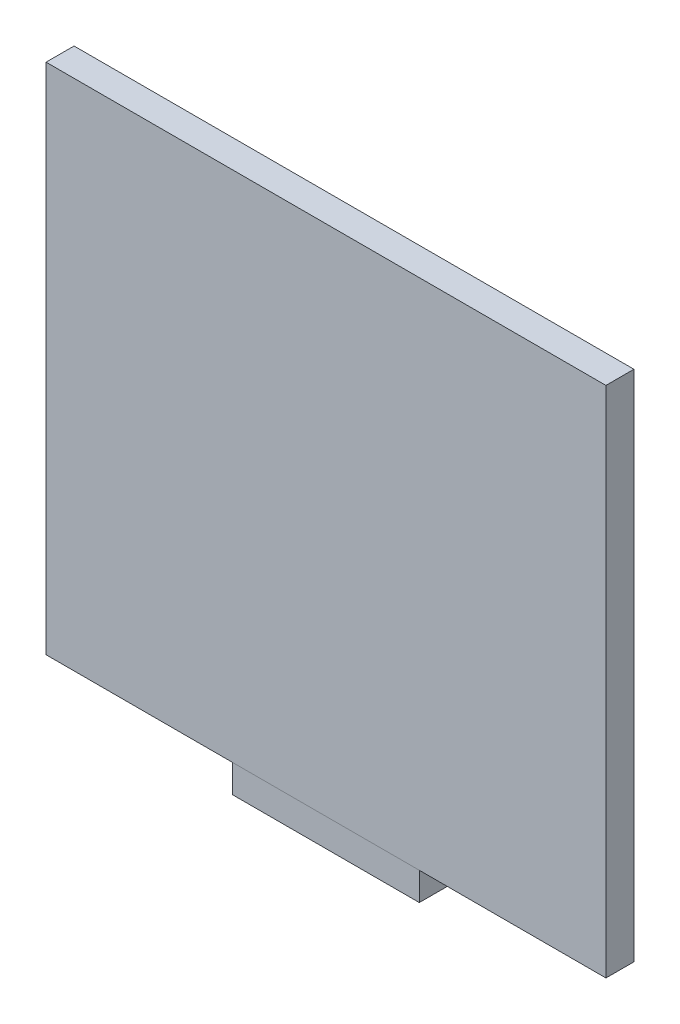
ISO-10303-21;
HEADER;
FILE_DESCRIPTION(('STEP AP214'),'2;1');
FILE_NAME('part.step','',(''),(''),'','','');
FILE_SCHEMA(('AUTOMOTIVE_DESIGN { 1 0 10303 214 1 1 1 1 }'));
ENDSEC;
DATA;
#1=APPLICATION_CONTEXT('core data for automotive mechanical design processes');
#2=APPLICATION_PROTOCOL_DEFINITION('international standard','automotive_design',2000,#1);
#3=PRODUCT_CONTEXT('',#1,'mechanical');
#4=PRODUCT('Part','Part','',(#3));
#5=PRODUCT_RELATED_PRODUCT_CATEGORY('part','',(#4));
#6=PRODUCT_DEFINITION_FORMATION('','',#4);
#7=PRODUCT_DEFINITION_CONTEXT('part definition',#1,'design');
#8=PRODUCT_DEFINITION('design','',#6,#7);
#9=PRODUCT_DEFINITION_SHAPE('','',#8);
#10=(LENGTH_UNIT() NAMED_UNIT(*) SI_UNIT(.MILLI.,.METRE.));
#11=(NAMED_UNIT(*) PLANE_ANGLE_UNIT() SI_UNIT($,.RADIAN.));
#12=(NAMED_UNIT(*) SI_UNIT($,.STERADIAN.) SOLID_ANGLE_UNIT());
#13=UNCERTAINTY_MEASURE_WITH_UNIT(LENGTH_MEASURE(1.E-05),#10,'distance_accuracy_value','');
#14=(GEOMETRIC_REPRESENTATION_CONTEXT(3) GLOBAL_UNCERTAINTY_ASSIGNED_CONTEXT((#13)) GLOBAL_UNIT_ASSIGNED_CONTEXT((#10,
#11,#12)) REPRESENTATION_CONTEXT('',''));
#15=CARTESIAN_POINT('',(0.,0.,0.));
#16=DIRECTION('',(0.,0.,1.));
#17=DIRECTION('',(1.,0.,0.));
#18=AXIS2_PLACEMENT_3D('',#15,#16,#17);
#19=CARTESIAN_POINT('',(20.,0.,-3.));
#20=DIRECTION('',(-1.,0.,0.));
#21=DIRECTION('',(0.,0.,1.));
#22=AXIS2_PLACEMENT_3D('',#19,#20,#21);
#23=PLANE('',#22);
#24=DIRECTION('',(0.,-1.,0.));
#25=VECTOR('',#24,1.);
#26=CARTESIAN_POINT('',(20.,0.,0.));
#27=LINE('',#26,#25);
#28=CARTESIAN_POINT('',(20.,0.,0.));
#29=VERTEX_POINT('',#28);
#30=CARTESIAN_POINT('',(20.,-3.,0.));
#31=VERTEX_POINT('',#30);
#32=EDGE_CURVE('E109',#29,#31,#27,.T.);
#33=ORIENTED_EDGE('',*,*,#32,.F.);
#34=DIRECTION('',(0.,0.,1.));
#35=VECTOR('',#34,1.);
#36=CARTESIAN_POINT('',(20.,0.,-3.));
#37=LINE('',#36,#35);
#38=CARTESIAN_POINT('',(20.,0.,-3.));
#39=VERTEX_POINT('',#38);
#40=EDGE_CURVE('E12',#39,#29,#37,.T.);
#41=ORIENTED_EDGE('',*,*,#40,.F.);
#42=DIRECTION('',(0.,-1.,0.));
#43=VECTOR('',#42,1.);
#44=CARTESIAN_POINT('',(20.,0.,-3.));
#45=LINE('',#44,#43);
#46=CARTESIAN_POINT('',(20.,-3.,-3.));
#47=VERTEX_POINT('',#46);
#48=EDGE_CURVE('E103',#39,#47,#45,.T.);
#49=ORIENTED_EDGE('',*,*,#48,.T.);
#50=DIRECTION('',(0.,0.,1.));
#51=VECTOR('',#50,1.);
#52=CARTESIAN_POINT('',(20.,-3.,-3.));
#53=LINE('',#52,#51);
#54=EDGE_CURVE('E48',#47,#31,#53,.T.);
#55=ORIENTED_EDGE('',*,*,#54,.T.);
#56=EDGE_LOOP('',(#33,#41,#49,#55));
#57=FACE_BOUND('',#56,.T.);
#58=ADVANCED_FACE('F45',(#57),#23,.T.);
#59=CARTESIAN_POINT('',(20.,0.,-3.));
#60=DIRECTION('',(0.,1.,0.));
#61=DIRECTION('',(0.,0.,1.));
#62=AXIS2_PLACEMENT_3D('',#59,#60,#61);
#63=PLANE('',#62);
#64=DIRECTION('',(-1.,0.,0.));
#65=VECTOR('',#64,1.);
#66=CARTESIAN_POINT('',(20.,0.,0.));
#67=LINE('',#66,#65);
#68=CARTESIAN_POINT('',(40.,0.,0.));
#69=VERTEX_POINT('',#68);
#70=EDGE_CURVE('E105',#69,#29,#67,.T.);
#71=ORIENTED_EDGE('',*,*,#70,.F.);
#72=DIRECTION('',(0.,0.,1.));
#73=VECTOR('',#72,1.);
#74=CARTESIAN_POINT('',(40.,0.,-3.));
#75=LINE('',#74,#73);
#76=CARTESIAN_POINT('',(40.,0.,-3.));
#77=VERTEX_POINT('',#76);
#78=EDGE_CURVE('E54',#77,#69,#75,.T.);
#79=ORIENTED_EDGE('',*,*,#78,.F.);
#80=DIRECTION('',(-1.,0.,0.));
#81=VECTOR('',#80,1.);
#82=CARTESIAN_POINT('',(20.,0.,-3.));
#83=LINE('',#82,#81);
#84=EDGE_CURVE('E100',#77,#39,#83,.T.);
#85=ORIENTED_EDGE('',*,*,#84,.T.);
#86=ORIENTED_EDGE('',*,*,#40,.T.);
#87=EDGE_LOOP('',(#71,#79,#85,#86));
#88=FACE_BOUND('',#87,.T.);
#89=ADVANCED_FACE('F119',(#88),#63,.T.);
#90=CARTESIAN_POINT('',(40.,0.,-3.));
#91=DIRECTION('',(1.,0.,0.));
#92=DIRECTION('',(0.,0.,-1.));
#93=AXIS2_PLACEMENT_3D('',#90,#91,#92);
#94=PLANE('',#93);
#95=DIRECTION('',(0.,1.,0.));
#96=VECTOR('',#95,1.);
#97=CARTESIAN_POINT('',(40.,0.,0.));
#98=LINE('',#97,#96);
#99=CARTESIAN_POINT('',(40.,-3.,0.));
#100=VERTEX_POINT('',#99);
#101=EDGE_CURVE('E95',#100,#69,#98,.T.);
#102=ORIENTED_EDGE('',*,*,#101,.F.);
#103=DIRECTION('',(0.,0.,1.));
#104=VECTOR('',#103,1.);
#105=CARTESIAN_POINT('',(40.,-3.,-3.));
#106=LINE('',#105,#104);
#107=CARTESIAN_POINT('',(40.,-3.,-3.));
#108=VERTEX_POINT('',#107);
#109=EDGE_CURVE('E90',#108,#100,#106,.T.);
#110=ORIENTED_EDGE('',*,*,#109,.F.);
#111=DIRECTION('',(0.,1.,0.));
#112=VECTOR('',#111,1.);
#113=CARTESIAN_POINT('',(40.,0.,-3.));
#114=LINE('',#113,#112);
#115=EDGE_CURVE('E93',#108,#77,#114,.T.);
#116=ORIENTED_EDGE('',*,*,#115,.T.);
#117=ORIENTED_EDGE('',*,*,#78,.T.);
#118=EDGE_LOOP('',(#102,#110,#116,#117));
#119=FACE_BOUND('',#118,.T.);
#120=ADVANCED_FACE('F92',(#119),#94,.T.);
#121=CARTESIAN_POINT('',(20.,-3.,-3.));
#122=DIRECTION('',(0.,-1.,0.));
#123=DIRECTION('',(1.,0.,0.));
#124=AXIS2_PLACEMENT_3D('',#121,#122,#123);
#125=PLANE('',#124);
#126=DIRECTION('',(1.,0.,0.));
#127=VECTOR('',#126,1.);
#128=CARTESIAN_POINT('',(20.,-3.,0.));
#129=LINE('',#128,#127);
#130=EDGE_CURVE('E112',#31,#100,#129,.T.);
#131=ORIENTED_EDGE('',*,*,#130,.F.);
#132=ORIENTED_EDGE('',*,*,#54,.F.);
#133=DIRECTION('',(1.,0.,0.));
#134=VECTOR('',#133,1.);
#135=CARTESIAN_POINT('',(20.,-3.,-3.));
#136=LINE('',#135,#134);
#137=EDGE_CURVE('E99',#47,#108,#136,.T.);
#138=ORIENTED_EDGE('',*,*,#137,.T.);
#139=ORIENTED_EDGE('',*,*,#109,.T.);
#140=EDGE_LOOP('',(#131,#132,#138,#139));
#141=FACE_BOUND('',#140,.T.);
#142=ADVANCED_FACE('F102',(#141),#125,.T.);
#143=CARTESIAN_POINT('',(0.,0.,-3.));
#144=DIRECTION('',(0.,0.,1.));
#145=DIRECTION('',(1.,0.,0.));
#146=AXIS2_PLACEMENT_3D('',#143,#144,#145);
#147=PLANE('',#146);
#148=ORIENTED_EDGE('',*,*,#48,.F.);
#149=ORIENTED_EDGE('',*,*,#84,.F.);
#150=ORIENTED_EDGE('',*,*,#115,.F.);
#151=ORIENTED_EDGE('',*,*,#137,.F.);
#152=EDGE_LOOP('',(#148,#149,#150,#151));
#153=FACE_BOUND('',#152,.T.);
#154=ADVANCED_FACE('F98',(#153),#147,.F.);
#155=CARTESIAN_POINT('',(0.,0.,0.));
#156=DIRECTION('',(0.,0.,1.));
#157=DIRECTION('',(1.,0.,0.));
#158=AXIS2_PLACEMENT_3D('',#155,#156,#157);
#159=PLANE('',#158);
#160=ORIENTED_EDGE('',*,*,#32,.T.);
#161=ORIENTED_EDGE('',*,*,#130,.T.);
#162=ORIENTED_EDGE('',*,*,#101,.T.);
#163=ORIENTED_EDGE('',*,*,#70,.T.);
#164=EDGE_LOOP('',(#160,#161,#162,#163));
#165=FACE_BOUND('',#164,.T.);
#166=ADVANCED_FACE('F118',(#165),#159,.T.);
#167=CLOSED_SHELL('',(#58,#89,#120,#142,#154,#166));
#168=MANIFOLD_SOLID_BREP('B2',#167);
#169=CARTESIAN_POINT('',(0.,0.,-3.));
#170=DIRECTION('',(-1.,0.,0.));
#171=DIRECTION('',(0.,-1.,0.));
#172=AXIS2_PLACEMENT_3D('',#169,#170,#171);
#173=PLANE('',#172);
#174=DIRECTION('',(0.,-1.,0.));
#175=VECTOR('',#174,1.);
#176=CARTESIAN_POINT('',(0.,0.,0.));
#177=LINE('',#176,#175);
#178=CARTESIAN_POINT('',(0.,55.,0.));
#179=VERTEX_POINT('',#178);
#180=CARTESIAN_POINT('',(0.,0.,0.));
#181=VERTEX_POINT('',#180);
#182=EDGE_CURVE('E233',#179,#181,#177,.T.);
#183=ORIENTED_EDGE('',*,*,#182,.F.);
#184=DIRECTION('',(0.,0.,1.));
#185=VECTOR('',#184,1.);
#186=CARTESIAN_POINT('',(0.,55.,-3.));
#187=LINE('',#186,#185);
#188=CARTESIAN_POINT('',(0.,55.,-3.));
#189=VERTEX_POINT('',#188);
#190=EDGE_CURVE('E43',#189,#179,#187,.T.);
#191=ORIENTED_EDGE('',*,*,#190,.F.);
#192=DIRECTION('',(0.,-1.,0.));
#193=VECTOR('',#192,1.);
#194=CARTESIAN_POINT('',(0.,0.,-3.));
#195=LINE('',#194,#193);
#196=CARTESIAN_POINT('',(0.,0.,-3.));
#197=VERTEX_POINT('',#196);
#198=EDGE_CURVE('E227',#189,#197,#195,.T.);
#199=ORIENTED_EDGE('',*,*,#198,.T.);
#200=DIRECTION('',(0.,0.,1.));
#201=VECTOR('',#200,1.);
#202=CARTESIAN_POINT('',(0.,0.,-3.));
#203=LINE('',#202,#201);
#204=EDGE_CURVE('E172',#197,#181,#203,.T.);
#205=ORIENTED_EDGE('',*,*,#204,.T.);
#206=EDGE_LOOP('',(#183,#191,#199,#205));
#207=FACE_BOUND('',#206,.T.);
#208=ADVANCED_FACE('F169',(#207),#173,.T.);
#209=CARTESIAN_POINT('',(0.,55.,-3.));
#210=DIRECTION('',(0.,1.,0.));
#211=DIRECTION('',(0.,0.,1.));
#212=AXIS2_PLACEMENT_3D('',#209,#210,#211);
#213=PLANE('',#212);
#214=DIRECTION('',(-1.,0.,0.));
#215=VECTOR('',#214,1.);
#216=CARTESIAN_POINT('',(0.,55.,0.));
#217=LINE('',#216,#215);
#218=CARTESIAN_POINT('',(60.,55.,0.));
#219=VERTEX_POINT('',#218);
#220=EDGE_CURVE('E229',#219,#179,#217,.T.);
#221=ORIENTED_EDGE('',*,*,#220,.F.);
#222=DIRECTION('',(0.,0.,1.));
#223=VECTOR('',#222,1.);
#224=CARTESIAN_POINT('',(60.,55.,-3.));
#225=LINE('',#224,#223);
#226=CARTESIAN_POINT('',(60.,55.,-3.));
#227=VERTEX_POINT('',#226);
#228=EDGE_CURVE('E178',#227,#219,#225,.T.);
#229=ORIENTED_EDGE('',*,*,#228,.F.);
#230=DIRECTION('',(-1.,0.,0.));
#231=VECTOR('',#230,1.);
#232=CARTESIAN_POINT('',(0.,55.,-3.));
#233=LINE('',#232,#231);
#234=EDGE_CURVE('E224',#227,#189,#233,.T.);
#235=ORIENTED_EDGE('',*,*,#234,.T.);
#236=ORIENTED_EDGE('',*,*,#190,.T.);
#237=EDGE_LOOP('',(#221,#229,#235,#236));
#238=FACE_BOUND('',#237,.T.);
#239=ADVANCED_FACE('F243',(#238),#213,.T.);
#240=CARTESIAN_POINT('',(60.,0.,-3.));
#241=DIRECTION('',(1.,0.,0.));
#242=DIRECTION('',(0.,1.,0.));
#243=AXIS2_PLACEMENT_3D('',#240,#241,#242);
#244=PLANE('',#243);
#245=DIRECTION('',(0.,1.,0.));
#246=VECTOR('',#245,1.);
#247=CARTESIAN_POINT('',(60.,0.,0.));
#248=LINE('',#247,#246);
#249=CARTESIAN_POINT('',(60.,0.,0.));
#250=VERTEX_POINT('',#249);
#251=EDGE_CURVE('E219',#250,#219,#248,.T.);
#252=ORIENTED_EDGE('',*,*,#251,.F.);
#253=DIRECTION('',(0.,0.,1.));
#254=VECTOR('',#253,1.);
#255=CARTESIAN_POINT('',(60.,0.,-3.));
#256=LINE('',#255,#254);
#257=CARTESIAN_POINT('',(60.,0.,-3.));
#258=VERTEX_POINT('',#257);
#259=EDGE_CURVE('E214',#258,#250,#256,.T.);
#260=ORIENTED_EDGE('',*,*,#259,.F.);
#261=DIRECTION('',(0.,1.,0.));
#262=VECTOR('',#261,1.);
#263=CARTESIAN_POINT('',(60.,0.,-3.));
#264=LINE('',#263,#262);
#265=EDGE_CURVE('E217',#258,#227,#264,.T.);
#266=ORIENTED_EDGE('',*,*,#265,.T.);
#267=ORIENTED_EDGE('',*,*,#228,.T.);
#268=EDGE_LOOP('',(#252,#260,#266,#267));
#269=FACE_BOUND('',#268,.T.);
#270=ADVANCED_FACE('F216',(#269),#244,.T.);
#271=CARTESIAN_POINT('',(0.,0.,-3.));
#272=DIRECTION('',(0.,-1.,0.));
#273=DIRECTION('',(0.,0.,-1.));
#274=AXIS2_PLACEMENT_3D('',#271,#272,#273);
#275=PLANE('',#274);
#276=DIRECTION('',(1.,0.,0.));
#277=VECTOR('',#276,1.);
#278=CARTESIAN_POINT('',(0.,0.,0.));
#279=LINE('',#278,#277);
#280=EDGE_CURVE('E236',#181,#250,#279,.T.);
#281=ORIENTED_EDGE('',*,*,#280,.F.);
#282=ORIENTED_EDGE('',*,*,#204,.F.);
#283=DIRECTION('',(1.,0.,0.));
#284=VECTOR('',#283,1.);
#285=CARTESIAN_POINT('',(0.,0.,-3.));
#286=LINE('',#285,#284);
#287=EDGE_CURVE('E223',#197,#258,#286,.T.);
#288=ORIENTED_EDGE('',*,*,#287,.T.);
#289=ORIENTED_EDGE('',*,*,#259,.T.);
#290=EDGE_LOOP('',(#281,#282,#288,#289));
#291=FACE_BOUND('',#290,.T.);
#292=ADVANCED_FACE('F226',(#291),#275,.T.);
#293=CARTESIAN_POINT('',(0.,0.,-3.));
#294=DIRECTION('',(0.,0.,-1.));
#295=DIRECTION('',(-1.,0.,0.));
#296=AXIS2_PLACEMENT_3D('',#293,#294,#295);
#297=PLANE('',#296);
#298=ORIENTED_EDGE('',*,*,#198,.F.);
#299=ORIENTED_EDGE('',*,*,#234,.F.);
#300=ORIENTED_EDGE('',*,*,#265,.F.);
#301=ORIENTED_EDGE('',*,*,#287,.F.);
#302=EDGE_LOOP('',(#298,#299,#300,#301));
#303=FACE_BOUND('',#302,.T.);
#304=ADVANCED_FACE('F222',(#303),#297,.T.);
#305=CARTESIAN_POINT('',(0.,0.,0.));
#306=DIRECTION('',(0.,0.,-1.));
#307=DIRECTION('',(-1.,0.,0.));
#308=AXIS2_PLACEMENT_3D('',#305,#306,#307);
#309=PLANE('',#308);
#310=ORIENTED_EDGE('',*,*,#182,.T.);
#311=ORIENTED_EDGE('',*,*,#280,.T.);
#312=ORIENTED_EDGE('',*,*,#251,.T.);
#313=ORIENTED_EDGE('',*,*,#220,.T.);
#314=EDGE_LOOP('',(#310,#311,#312,#313));
#315=FACE_BOUND('',#314,.T.);
#316=ADVANCED_FACE('F242',(#315),#309,.F.);
#317=CLOSED_SHELL('',(#208,#239,#270,#292,#304,#316));
#318=MANIFOLD_SOLID_BREP('B6',#317);
#319=ADVANCED_BREP_SHAPE_REPRESENTATION('',(#18,#168,#318),#14);
#320=SHAPE_DEFINITION_REPRESENTATION(#9,#319);
ENDSEC;
END-ISO-10303-21;
